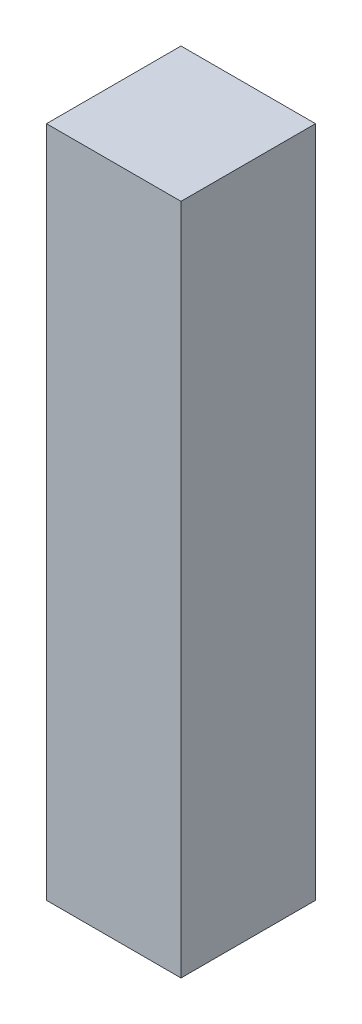
ISO-10303-21;
HEADER;
FILE_DESCRIPTION(('STEP AP214'),'2;1');
FILE_NAME('part.step','',(''),(''),'','','');
FILE_SCHEMA(('AUTOMOTIVE_DESIGN { 1 0 10303 214 1 1 1 1 }'));
ENDSEC;
DATA;
#1=APPLICATION_CONTEXT('core data for automotive mechanical design processes');
#2=APPLICATION_PROTOCOL_DEFINITION('international standard','automotive_design',2000,#1);
#3=PRODUCT_CONTEXT('',#1,'mechanical');
#4=PRODUCT('Part','Part','',(#3));
#5=PRODUCT_RELATED_PRODUCT_CATEGORY('part','',(#4));
#6=PRODUCT_DEFINITION_FORMATION('','',#4);
#7=PRODUCT_DEFINITION_CONTEXT('part definition',#1,'design');
#8=PRODUCT_DEFINITION('design','',#6,#7);
#9=PRODUCT_DEFINITION_SHAPE('','',#8);
#10=(LENGTH_UNIT() NAMED_UNIT(*) SI_UNIT(.MILLI.,.METRE.));
#11=(NAMED_UNIT(*) PLANE_ANGLE_UNIT() SI_UNIT($,.RADIAN.));
#12=(NAMED_UNIT(*) SI_UNIT($,.STERADIAN.) SOLID_ANGLE_UNIT());
#13=UNCERTAINTY_MEASURE_WITH_UNIT(LENGTH_MEASURE(1.E-05),#10,'distance_accuracy_value','');
#14=(GEOMETRIC_REPRESENTATION_CONTEXT(3) GLOBAL_UNCERTAINTY_ASSIGNED_CONTEXT((#13)) GLOBAL_UNIT_ASSIGNED_CONTEXT((#10,
#11,#12)) REPRESENTATION_CONTEXT('',''));
#15=CARTESIAN_POINT('',(0.,0.,0.));
#16=DIRECTION('',(0.,0.,1.));
#17=DIRECTION('',(1.,0.,0.));
#18=AXIS2_PLACEMENT_3D('',#15,#16,#17);
#19=CARTESIAN_POINT('',(500.,5000.,500.));
#20=DIRECTION('',(-1.,0.,0.));
#21=DIRECTION('',(0.,0.,1.));
#22=AXIS2_PLACEMENT_3D('',#19,#20,#21);
#23=PLANE('',#22);
#24=DIRECTION('',(0.,0.,-1.));
#25=VECTOR('',#24,1.);
#26=CARTESIAN_POINT('',(500.,0.,500.));
#27=LINE('',#26,#25);
#28=CARTESIAN_POINT('',(500.,0.,500.));
#29=VERTEX_POINT('',#28);
#30=CARTESIAN_POINT('',(500.,0.,-500.));
#31=VERTEX_POINT('',#30);
#32=EDGE_CURVE('E106',#29,#31,#27,.T.);
#33=ORIENTED_EDGE('',*,*,#32,.T.);
#34=DIRECTION('',(0.,-1.,0.));
#35=VECTOR('',#34,1.);
#36=CARTESIAN_POINT('',(500.,5000.,-500.));
#37=LINE('',#36,#35);
#38=CARTESIAN_POINT('',(500.,5000.,-500.));
#39=VERTEX_POINT('',#38);
#40=EDGE_CURVE('E11',#39,#31,#37,.T.);
#41=ORIENTED_EDGE('',*,*,#40,.F.);
#42=DIRECTION('',(0.,0.,-1.));
#43=VECTOR('',#42,1.);
#44=CARTESIAN_POINT('',(500.,5000.,500.));
#45=LINE('',#44,#43);
#46=CARTESIAN_POINT('',(500.,5000.,500.));
#47=VERTEX_POINT('',#46);
#48=EDGE_CURVE('E94',#47,#39,#45,.T.);
#49=ORIENTED_EDGE('',*,*,#48,.F.);
#50=DIRECTION('',(0.,-1.,0.));
#51=VECTOR('',#50,1.);
#52=CARTESIAN_POINT('',(500.,5000.,500.));
#53=LINE('',#52,#51);
#54=EDGE_CURVE('E102',#47,#29,#53,.T.);
#55=ORIENTED_EDGE('',*,*,#54,.T.);
#56=EDGE_LOOP('',(#33,#41,#49,#55));
#57=FACE_BOUND('',#56,.T.);
#58=ADVANCED_FACE('F43',(#57),#23,.F.);
#59=CARTESIAN_POINT('',(-500.,5000.,-500.));
#60=DIRECTION('',(0.,0.,1.));
#61=DIRECTION('',(1.,0.,0.));
#62=AXIS2_PLACEMENT_3D('',#59,#60,#61);
#63=PLANE('',#62);
#64=DIRECTION('',(-1.,0.,0.));
#65=VECTOR('',#64,1.);
#66=CARTESIAN_POINT('',(-500.,0.,-500.));
#67=LINE('',#66,#65);
#68=CARTESIAN_POINT('',(-500.,0.,-500.));
#69=VERTEX_POINT('',#68);
#70=EDGE_CURVE('E98',#31,#69,#67,.T.);
#71=ORIENTED_EDGE('',*,*,#70,.T.);
#72=DIRECTION('',(0.,-1.,0.));
#73=VECTOR('',#72,1.);
#74=CARTESIAN_POINT('',(-500.,5000.,-500.));
#75=LINE('',#74,#73);
#76=CARTESIAN_POINT('',(-500.,5000.,-500.));
#77=VERTEX_POINT('',#76);
#78=EDGE_CURVE('E51',#77,#69,#75,.T.);
#79=ORIENTED_EDGE('',*,*,#78,.F.);
#80=DIRECTION('',(-1.,0.,0.));
#81=VECTOR('',#80,1.);
#82=CARTESIAN_POINT('',(-500.,5000.,-500.));
#83=LINE('',#82,#81);
#84=EDGE_CURVE('E89',#39,#77,#83,.T.);
#85=ORIENTED_EDGE('',*,*,#84,.F.);
#86=ORIENTED_EDGE('',*,*,#40,.T.);
#87=EDGE_LOOP('',(#71,#79,#85,#86));
#88=FACE_BOUND('',#87,.T.);
#89=ADVANCED_FACE('F97',(#88),#63,.F.);
#90=CARTESIAN_POINT('',(-500.,5000.,500.));
#91=DIRECTION('',(1.,0.,0.));
#92=DIRECTION('',(0.,0.,-1.));
#93=AXIS2_PLACEMENT_3D('',#90,#91,#92);
#94=PLANE('',#93);
#95=DIRECTION('',(0.,0.,1.));
#96=VECTOR('',#95,1.);
#97=CARTESIAN_POINT('',(-500.,0.,500.));
#98=LINE('',#97,#96);
#99=CARTESIAN_POINT('',(-500.,0.,500.));
#100=VERTEX_POINT('',#99);
#101=EDGE_CURVE('E76',#69,#100,#98,.T.);
#102=ORIENTED_EDGE('',*,*,#101,.T.);
#103=DIRECTION('',(0.,-1.,0.));
#104=VECTOR('',#103,1.);
#105=CARTESIAN_POINT('',(-500.,5000.,500.));
#106=LINE('',#105,#104);
#107=CARTESIAN_POINT('',(-500.,5000.,500.));
#108=VERTEX_POINT('',#107);
#109=EDGE_CURVE('E99',#108,#100,#106,.T.);
#110=ORIENTED_EDGE('',*,*,#109,.F.);
#111=DIRECTION('',(0.,0.,1.));
#112=VECTOR('',#111,1.);
#113=CARTESIAN_POINT('',(-500.,5000.,500.));
#114=LINE('',#113,#112);
#115=EDGE_CURVE('E92',#77,#108,#114,.T.);
#116=ORIENTED_EDGE('',*,*,#115,.F.);
#117=ORIENTED_EDGE('',*,*,#78,.T.);
#118=EDGE_LOOP('',(#102,#110,#116,#117));
#119=FACE_BOUND('',#118,.T.);
#120=ADVANCED_FACE('F100',(#119),#94,.F.);
#121=CARTESIAN_POINT('',(-500.,5000.,500.));
#122=DIRECTION('',(0.,0.,-1.));
#123=DIRECTION('',(-1.,0.,0.));
#124=AXIS2_PLACEMENT_3D('',#121,#122,#123);
#125=PLANE('',#124);
#126=DIRECTION('',(1.,0.,0.));
#127=VECTOR('',#126,1.);
#128=CARTESIAN_POINT('',(-500.,0.,500.));
#129=LINE('',#128,#127);
#130=EDGE_CURVE('E82',#100,#29,#129,.T.);
#131=ORIENTED_EDGE('',*,*,#130,.T.);
#132=ORIENTED_EDGE('',*,*,#54,.F.);
#133=DIRECTION('',(1.,0.,0.));
#134=VECTOR('',#133,1.);
#135=CARTESIAN_POINT('',(-500.,5000.,500.));
#136=LINE('',#135,#134);
#137=EDGE_CURVE('E59',#108,#47,#136,.T.);
#138=ORIENTED_EDGE('',*,*,#137,.F.);
#139=ORIENTED_EDGE('',*,*,#109,.T.);
#140=EDGE_LOOP('',(#131,#132,#138,#139));
#141=FACE_BOUND('',#140,.T.);
#142=ADVANCED_FACE('F113',(#141),#125,.F.);
#143=CARTESIAN_POINT('',(0.,5000.,0.));
#144=DIRECTION('',(0.,-1.,0.));
#145=DIRECTION('',(0.,0.,-1.));
#146=AXIS2_PLACEMENT_3D('',#143,#144,#145);
#147=PLANE('',#146);
#148=ORIENTED_EDGE('',*,*,#48,.T.);
#149=ORIENTED_EDGE('',*,*,#84,.T.);
#150=ORIENTED_EDGE('',*,*,#115,.T.);
#151=ORIENTED_EDGE('',*,*,#137,.T.);
#152=EDGE_LOOP('',(#148,#149,#150,#151));
#153=FACE_BOUND('',#152,.T.);
#154=ADVANCED_FACE('F90',(#153),#147,.F.);
#155=CARTESIAN_POINT('',(0.,0.,0.));
#156=DIRECTION('',(0.,-1.,0.));
#157=DIRECTION('',(0.,0.,-1.));
#158=AXIS2_PLACEMENT_3D('',#155,#156,#157);
#159=PLANE('',#158);
#160=ORIENTED_EDGE('',*,*,#32,.F.);
#161=ORIENTED_EDGE('',*,*,#130,.F.);
#162=ORIENTED_EDGE('',*,*,#101,.F.);
#163=ORIENTED_EDGE('',*,*,#70,.F.);
#164=EDGE_LOOP('',(#160,#161,#162,#163));
#165=FACE_BOUND('',#164,.T.);
#166=ADVANCED_FACE('F116',(#165),#159,.T.);
#167=CLOSED_SHELL('',(#58,#89,#120,#142,#154,#166));
#168=MANIFOLD_SOLID_BREP('B2',#167);
#169=ADVANCED_BREP_SHAPE_REPRESENTATION('',(#18,#168),#14);
#170=SHAPE_DEFINITION_REPRESENTATION(#9,#169);
ENDSEC;
END-ISO-10303-21;
